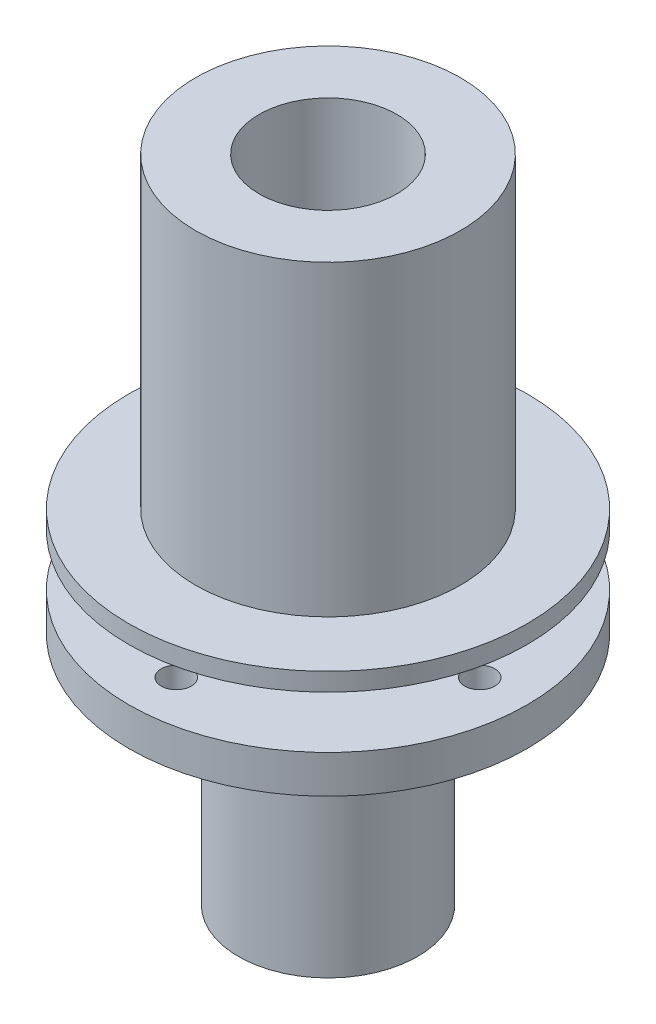
ISO-10303-21;
HEADER;
FILE_DESCRIPTION(('STEP AP214'),'2;1');
FILE_NAME('part.step','',(''),(''),'','','');
FILE_SCHEMA(('AUTOMOTIVE_DESIGN { 1 0 10303 214 1 1 1 1 }'));
ENDSEC;
DATA;
#1=APPLICATION_CONTEXT('core data for automotive mechanical design processes');
#2=APPLICATION_PROTOCOL_DEFINITION('international standard','automotive_design',2000,#1);
#3=PRODUCT_CONTEXT('',#1,'mechanical');
#4=PRODUCT('Part','Part','',(#3));
#5=PRODUCT_RELATED_PRODUCT_CATEGORY('part','',(#4));
#6=PRODUCT_DEFINITION_FORMATION('','',#4);
#7=PRODUCT_DEFINITION_CONTEXT('part definition',#1,'design');
#8=PRODUCT_DEFINITION('design','',#6,#7);
#9=PRODUCT_DEFINITION_SHAPE('','',#8);
#10=(LENGTH_UNIT() NAMED_UNIT(*) SI_UNIT(.MILLI.,.METRE.));
#11=(NAMED_UNIT(*) PLANE_ANGLE_UNIT() SI_UNIT($,.RADIAN.));
#12=(NAMED_UNIT(*) SI_UNIT($,.STERADIAN.) SOLID_ANGLE_UNIT());
#13=UNCERTAINTY_MEASURE_WITH_UNIT(LENGTH_MEASURE(1.E-05),#10,'distance_accuracy_value','');
#14=(GEOMETRIC_REPRESENTATION_CONTEXT(3) GLOBAL_UNCERTAINTY_ASSIGNED_CONTEXT((#13)) GLOBAL_UNIT_ASSIGNED_CONTEXT((#10,
#11,#12)) REPRESENTATION_CONTEXT('',''));
#15=CARTESIAN_POINT('',(0.,0.,0.));
#16=DIRECTION('',(0.,0.,1.));
#17=DIRECTION('',(1.,0.,0.));
#18=AXIS2_PLACEMENT_3D('',#15,#16,#17);
#19=CARTESIAN_POINT('',(0.,109.47402,0.));
#20=DIRECTION('',(0.,1.,0.));
#21=DIRECTION('',(0.,0.,1.));
#22=AXIS2_PLACEMENT_3D('',#19,#20,#21);
#23=PLANE('',#22);
#24=CARTESIAN_POINT('',(0.,109.47402,0.));
#25=DIRECTION('',(0.,1.,0.));
#26=DIRECTION('',(0.,0.,1.));
#27=AXIS2_PLACEMENT_3D('',#24,#25,#26);
#28=CIRCLE('',#27,34.925);
#29=CARTESIAN_POINT('',(0.,109.47402,34.925));
#30=VERTEX_POINT('',#29);
#31=EDGE_CURVE('E11',#30,#30,#28,.T.);
#32=ORIENTED_EDGE('',*,*,#31,.T.);
#33=EDGE_LOOP('',(#32));
#34=FACE_BOUND('',#33,.T.);
#35=CARTESIAN_POINT('',(0.,109.47402,0.));
#36=DIRECTION('',(0.,1.,0.));
#37=DIRECTION('',(0.,0.,1.));
#38=AXIS2_PLACEMENT_3D('',#35,#36,#37);
#39=CIRCLE('',#38,18.161);
#40=CARTESIAN_POINT('',(0.,109.47402,18.161));
#41=VERTEX_POINT('',#40);
#42=EDGE_CURVE('E61',#41,#41,#39,.T.);
#43=ORIENTED_EDGE('',*,*,#42,.F.);
#44=EDGE_LOOP('',(#43));
#45=FACE_BOUND('',#44,.T.);
#46=ADVANCED_FACE('F50',(#34,#45),#23,.T.);
#47=CARTESIAN_POINT('',(0.,28.51152,0.));
#48=DIRECTION('',(0.,1.,0.));
#49=DIRECTION('',(0.,0.,1.));
#50=AXIS2_PLACEMENT_3D('',#47,#48,#49);
#51=PLANE('',#50);
#52=CARTESIAN_POINT('',(0.,28.51152,0.));
#53=DIRECTION('',(0.,1.,0.));
#54=DIRECTION('',(0.,0.,1.));
#55=AXIS2_PLACEMENT_3D('',#52,#53,#54);
#56=CIRCLE('',#55,34.925);
#57=CARTESIAN_POINT('',(0.,28.51152,34.925));
#58=VERTEX_POINT('',#57);
#59=EDGE_CURVE('E54',#58,#58,#56,.T.);
#60=ORIENTED_EDGE('',*,*,#59,.F.);
#61=EDGE_LOOP('',(#60));
#62=FACE_BOUND('',#61,.T.);
#63=CARTESIAN_POINT('',(0.,28.51152,0.));
#64=DIRECTION('',(0.,1.,0.));
#65=DIRECTION('',(0.,0.,1.));
#66=AXIS2_PLACEMENT_3D('',#63,#64,#65);
#67=CIRCLE('',#66,18.161);
#68=CARTESIAN_POINT('',(0.,28.51152,18.161));
#69=VERTEX_POINT('',#68);
#70=EDGE_CURVE('E63',#69,#69,#67,.T.);
#71=ORIENTED_EDGE('',*,*,#70,.T.);
#72=EDGE_LOOP('',(#71));
#73=FACE_BOUND('',#72,.T.);
#74=ADVANCED_FACE('F73',(#62,#73),#51,.F.);
#75=CARTESIAN_POINT('',(0.,109.47402,0.));
#76=DIRECTION('',(0.,-1.,0.));
#77=DIRECTION('',(0.,0.,-1.));
#78=AXIS2_PLACEMENT_3D('',#75,#76,#77);
#79=CYLINDRICAL_SURFACE('',#78,34.925);
#80=ORIENTED_EDGE('',*,*,#31,.F.);
#81=EDGE_LOOP('',(#80));
#82=FACE_BOUND('',#81,.T.);
#83=ORIENTED_EDGE('',*,*,#59,.T.);
#84=EDGE_LOOP('',(#83));
#85=FACE_BOUND('',#84,.T.);
#86=ADVANCED_FACE('F52',(#82,#85),#79,.T.);
#87=CARTESIAN_POINT('',(0.,109.47402,0.));
#88=DIRECTION('',(0.,-1.,0.));
#89=DIRECTION('',(0.,0.,-1.));
#90=AXIS2_PLACEMENT_3D('',#87,#88,#89);
#91=CYLINDRICAL_SURFACE('',#90,18.161);
#92=ORIENTED_EDGE('',*,*,#42,.T.);
#93=EDGE_LOOP('',(#92));
#94=FACE_BOUND('',#93,.T.);
#95=ORIENTED_EDGE('',*,*,#70,.F.);
#96=EDGE_LOOP('',(#95));
#97=FACE_BOUND('',#96,.T.);
#98=ADVANCED_FACE('F69',(#94,#97),#91,.F.);
#99=CLOSED_SHELL('',(#46,#74,#86,#98));
#100=MANIFOLD_SOLID_BREP('B2',#99);
#101=CARTESIAN_POINT('',(0.,28.51152,0.));
#102=DIRECTION('',(0.,-1.,0.));
#103=DIRECTION('',(0.,0.,-1.));
#104=AXIS2_PLACEMENT_3D('',#101,#102,#103);
#105=CYLINDRICAL_SURFACE('',#104,25.4);
#106=CARTESIAN_POINT('',(0.,28.51152,0.));
#107=DIRECTION('',(0.,1.,0.));
#108=DIRECTION('',(0.,0.,1.));
#109=AXIS2_PLACEMENT_3D('',#106,#107,#108);
#110=CIRCLE('',#109,25.4);
#111=CARTESIAN_POINT('',(0.,28.51152,-25.4));
#112=VERTEX_POINT('',#111);
#113=EDGE_CURVE('E126',#112,#112,#110,.T.);
#114=CARTESIAN_POINT('',(0.,23.74902,0.));
#115=DIRECTION('',(0.,1.,0.));
#116=DIRECTION('',(0.,0.,1.));
#117=AXIS2_PLACEMENT_3D('',#114,#115,#116);
#118=CIRCLE('',#117,25.4);
#119=CARTESIAN_POINT('',(0.,23.74902,-25.4));
#120=VERTEX_POINT('',#119);
#121=EDGE_CURVE('E132',#120,#120,#118,.T.);
#122=CARTESIAN_POINT('',(0.,28.51152,-25.4));
#123=CARTESIAN_POINT('',(0.,28.461910625,-25.4));
#124=CARTESIAN_POINT('',(0.,28.41230125,-25.4));
#125=CARTESIAN_POINT('',(0.,28.3130825,-25.4));
#126=CARTESIAN_POINT('',(0.,28.263473125,-25.4));
#127=CARTESIAN_POINT('',(0.,28.164254375,-25.4));
#128=CARTESIAN_POINT('',(0.,28.114645,-25.4));
#129=CARTESIAN_POINT('',(0.,28.01542625,-25.4));
#130=CARTESIAN_POINT('',(0.,27.965816875,-25.4));
#131=CARTESIAN_POINT('',(0.,27.866598125,-25.4));
#132=CARTESIAN_POINT('',(0.,27.81698875,-25.4));
#133=CARTESIAN_POINT('',(0.,27.71777,-25.4));
#134=CARTESIAN_POINT('',(0.,27.668160625,-25.4));
#135=CARTESIAN_POINT('',(0.,27.568941875,-25.4));
#136=CARTESIAN_POINT('',(0.,27.5193325,-25.4));
#137=CARTESIAN_POINT('',(0.,27.42011375,-25.4));
#138=CARTESIAN_POINT('',(0.,27.370504375,-25.4));
#139=CARTESIAN_POINT('',(0.,27.271285625,-25.4));
#140=CARTESIAN_POINT('',(0.,27.22167625,-25.4));
#141=CARTESIAN_POINT('',(0.,27.1224575,-25.4));
#142=CARTESIAN_POINT('',(0.,27.072848125,-25.4));
#143=CARTESIAN_POINT('',(0.,26.973629375,-25.4));
#144=CARTESIAN_POINT('',(0.,26.92402,-25.4));
#145=CARTESIAN_POINT('',(0.,26.82480125,-25.4));
#146=CARTESIAN_POINT('',(0.,26.775191875,-25.4));
#147=CARTESIAN_POINT('',(0.,26.675973125,-25.4));
#148=CARTESIAN_POINT('',(0.,26.62636375,-25.4));
#149=CARTESIAN_POINT('',(0.,26.527145,-25.4));
#150=CARTESIAN_POINT('',(0.,26.477535625,-25.4));
#151=CARTESIAN_POINT('',(0.,26.378316875,-25.4));
#152=CARTESIAN_POINT('',(0.,26.3287075,-25.4));
#153=CARTESIAN_POINT('',(0.,26.22948875,-25.4));
#154=CARTESIAN_POINT('',(0.,26.179879375,-25.4));
#155=CARTESIAN_POINT('',(0.,26.080660625,-25.4));
#156=CARTESIAN_POINT('',(0.,26.03105125,-25.4));
#157=CARTESIAN_POINT('',(0.,25.9318325,-25.4));
#158=CARTESIAN_POINT('',(0.,25.882223125,-25.4));
#159=CARTESIAN_POINT('',(0.,25.783004375,-25.4));
#160=CARTESIAN_POINT('',(0.,25.733395,-25.4));
#161=CARTESIAN_POINT('',(0.,25.63417625,-25.4));
#162=CARTESIAN_POINT('',(0.,25.584566875,-25.4));
#163=CARTESIAN_POINT('',(0.,25.485348125,-25.4));
#164=CARTESIAN_POINT('',(0.,25.43573875,-25.4));
#165=CARTESIAN_POINT('',(0.,25.33652,-25.4));
#166=CARTESIAN_POINT('',(0.,25.286910625,-25.4));
#167=CARTESIAN_POINT('',(0.,25.187691875,-25.4));
#168=CARTESIAN_POINT('',(0.,25.1380825,-25.4));
#169=CARTESIAN_POINT('',(0.,25.03886375,-25.4));
#170=CARTESIAN_POINT('',(0.,24.989254375,-25.4));
#171=CARTESIAN_POINT('',(0.,24.890035625,-25.4));
#172=CARTESIAN_POINT('',(0.,24.84042625,-25.4));
#173=CARTESIAN_POINT('',(0.,24.7412075,-25.4));
#174=CARTESIAN_POINT('',(0.,24.691598125,-25.4));
#175=CARTESIAN_POINT('',(0.,24.592379375,-25.4));
#176=CARTESIAN_POINT('',(0.,24.54277,-25.4));
#177=CARTESIAN_POINT('',(0.,24.44355125,-25.4));
#178=CARTESIAN_POINT('',(0.,24.393941875,-25.4));
#179=CARTESIAN_POINT('',(0.,24.294723125,-25.4));
#180=CARTESIAN_POINT('',(0.,24.24511375,-25.4));
#181=CARTESIAN_POINT('',(0.,24.145895,-25.4));
#182=CARTESIAN_POINT('',(0.,24.096285625,-25.4));
#183=CARTESIAN_POINT('',(0.,23.997066875,-25.4));
#184=CARTESIAN_POINT('',(0.,23.9474575,-25.4));
#185=CARTESIAN_POINT('',(0.,23.84823875,-25.4));
#186=CARTESIAN_POINT('',(0.,23.798629375,-25.4));
#187=CARTESIAN_POINT('',(0.,23.74902,-25.4));
#188=B_SPLINE_CURVE_WITH_KNOTS('',3,(#122,#123,#124,#125,#126,#127,#128,#129,#130,#131,#132,
#133,#134,#135,#136,#137,#138,#139,#140,#141,#142,#143,#144,#145,#146,#147,#148,#149,#150,#151,
#152,#153,#154,#155,#156,#157,#158,#159,#160,#161,#162,#163,#164,#165,#166,#167,#168,#169,#170,
#171,#172,#173,#174,#175,#176,#177,#178,#179,#180,#181,#182,#183,#184,#185,#186,#187),
.UNSPECIFIED.,.F.,.F.,(4,2,2,2,2,2,2,2,2,2,2,2,2,2,2,2,2,2,2,2,2,2,2,2,2,2,2,2,2,2,2,2,4),(0.,
0.148828124999997,0.297656249999997,0.446484374999997,0.595312499999997,0.744140624999997,
0.892968749999997,1.041796875,1.190625,1.339453125,1.48828125,1.637109375,1.7859375,1.934765625,
2.08359375,2.232421875,2.38125,2.530078125,2.67890625,2.827734375,2.9765625,3.125390625,
3.27421875,3.423046875,3.571875,3.720703125,3.86953125,4.018359375,4.1671875,4.316015625,
4.46484375,4.613671875,4.7625),.UNSPECIFIED.);
#189=EDGE_CURVE('BSEAM119',#112,#120,#188,.T.);
#190=ORIENTED_EDGE('',*,*,#113,.T.);
#191=ORIENTED_EDGE('',*,*,#121,.F.);
#192=ORIENTED_EDGE('',*,*,#189,.T.);
#193=ORIENTED_EDGE('',*,*,#189,.F.);
#194=EDGE_LOOP('',(#190,#192,#191,#193));
#195=FACE_BOUND('',#194,.T.);
#196=ADVANCED_FACE('F119',(#195),#105,.F.);
#197=CARTESIAN_POINT('',(0.,28.51152,0.));
#198=DIRECTION('',(0.,-1.,0.));
#199=DIRECTION('',(0.,0.,-1.));
#200=AXIS2_PLACEMENT_3D('',#197,#198,#199);
#201=CYLINDRICAL_SURFACE('',#200,52.500000029);
#202=CARTESIAN_POINT('',(0.,28.51152,0.));
#203=DIRECTION('',(0.,1.,0.));
#204=DIRECTION('',(0.,0.,1.));
#205=AXIS2_PLACEMENT_3D('',#202,#203,#204);
#206=CIRCLE('',#205,52.500000029);
#207=CARTESIAN_POINT('',(0.,28.51152,-52.500000029));
#208=VERTEX_POINT('',#207);
#209=EDGE_CURVE('E49',#208,#208,#206,.T.);
#210=CARTESIAN_POINT('',(0.,23.74902,0.));
#211=DIRECTION('',(0.,1.,0.));
#212=DIRECTION('',(0.,0.,1.));
#213=AXIS2_PLACEMENT_3D('',#210,#211,#212);
#214=CIRCLE('',#213,52.500000029);
#215=CARTESIAN_POINT('',(0.,23.74902,-52.500000029));
#216=VERTEX_POINT('',#215);
#217=EDGE_CURVE('E122',#216,#216,#214,.T.);
#218=CARTESIAN_POINT('',(0.,28.51152,-52.500000029));
#219=CARTESIAN_POINT('',(0.,28.461910625,-52.500000029));
#220=CARTESIAN_POINT('',(0.,28.41230125,-52.500000029));
#221=CARTESIAN_POINT('',(0.,28.3130825,-52.500000029));
#222=CARTESIAN_POINT('',(0.,28.263473125,-52.500000029));
#223=CARTESIAN_POINT('',(0.,28.164254375,-52.500000029));
#224=CARTESIAN_POINT('',(0.,28.114645,-52.500000029));
#225=CARTESIAN_POINT('',(0.,28.01542625,-52.500000029));
#226=CARTESIAN_POINT('',(0.,27.965816875,-52.500000029));
#227=CARTESIAN_POINT('',(0.,27.866598125,-52.500000029));
#228=CARTESIAN_POINT('',(0.,27.81698875,-52.500000029));
#229=CARTESIAN_POINT('',(0.,27.71777,-52.500000029));
#230=CARTESIAN_POINT('',(0.,27.668160625,-52.500000029));
#231=CARTESIAN_POINT('',(0.,27.568941875,-52.500000029));
#232=CARTESIAN_POINT('',(0.,27.5193325,-52.500000029));
#233=CARTESIAN_POINT('',(0.,27.42011375,-52.500000029));
#234=CARTESIAN_POINT('',(0.,27.370504375,-52.500000029));
#235=CARTESIAN_POINT('',(0.,27.271285625,-52.500000029));
#236=CARTESIAN_POINT('',(0.,27.22167625,-52.500000029));
#237=CARTESIAN_POINT('',(0.,27.1224575,-52.500000029));
#238=CARTESIAN_POINT('',(0.,27.072848125,-52.500000029));
#239=CARTESIAN_POINT('',(0.,26.973629375,-52.500000029));
#240=CARTESIAN_POINT('',(0.,26.92402,-52.500000029));
#241=CARTESIAN_POINT('',(0.,26.82480125,-52.500000029));
#242=CARTESIAN_POINT('',(0.,26.775191875,-52.500000029));
#243=CARTESIAN_POINT('',(0.,26.675973125,-52.500000029));
#244=CARTESIAN_POINT('',(0.,26.62636375,-52.500000029));
#245=CARTESIAN_POINT('',(0.,26.527145,-52.500000029));
#246=CARTESIAN_POINT('',(0.,26.477535625,-52.500000029));
#247=CARTESIAN_POINT('',(0.,26.378316875,-52.500000029));
#248=CARTESIAN_POINT('',(0.,26.3287075,-52.500000029));
#249=CARTESIAN_POINT('',(0.,26.22948875,-52.500000029));
#250=CARTESIAN_POINT('',(0.,26.179879375,-52.500000029));
#251=CARTESIAN_POINT('',(0.,26.080660625,-52.500000029));
#252=CARTESIAN_POINT('',(0.,26.03105125,-52.500000029));
#253=CARTESIAN_POINT('',(0.,25.9318325,-52.500000029));
#254=CARTESIAN_POINT('',(0.,25.882223125,-52.500000029));
#255=CARTESIAN_POINT('',(0.,25.783004375,-52.500000029));
#256=CARTESIAN_POINT('',(0.,25.733395,-52.500000029));
#257=CARTESIAN_POINT('',(0.,25.63417625,-52.500000029));
#258=CARTESIAN_POINT('',(0.,25.584566875,-52.500000029));
#259=CARTESIAN_POINT('',(0.,25.485348125,-52.500000029));
#260=CARTESIAN_POINT('',(0.,25.43573875,-52.500000029));
#261=CARTESIAN_POINT('',(0.,25.33652,-52.500000029));
#262=CARTESIAN_POINT('',(0.,25.286910625,-52.500000029));
#263=CARTESIAN_POINT('',(0.,25.187691875,-52.500000029));
#264=CARTESIAN_POINT('',(0.,25.1380825,-52.500000029));
#265=CARTESIAN_POINT('',(0.,25.03886375,-52.500000029));
#266=CARTESIAN_POINT('',(0.,24.989254375,-52.500000029));
#267=CARTESIAN_POINT('',(0.,24.890035625,-52.500000029));
#268=CARTESIAN_POINT('',(0.,24.84042625,-52.500000029));
#269=CARTESIAN_POINT('',(0.,24.7412075,-52.500000029));
#270=CARTESIAN_POINT('',(0.,24.691598125,-52.500000029));
#271=CARTESIAN_POINT('',(0.,24.592379375,-52.500000029));
#272=CARTESIAN_POINT('',(0.,24.54277,-52.500000029));
#273=CARTESIAN_POINT('',(0.,24.44355125,-52.500000029));
#274=CARTESIAN_POINT('',(0.,24.393941875,-52.500000029));
#275=CARTESIAN_POINT('',(0.,24.294723125,-52.500000029));
#276=CARTESIAN_POINT('',(0.,24.24511375,-52.500000029));
#277=CARTESIAN_POINT('',(0.,24.145895,-52.500000029));
#278=CARTESIAN_POINT('',(0.,24.096285625,-52.500000029));
#279=CARTESIAN_POINT('',(0.,23.997066875,-52.500000029));
#280=CARTESIAN_POINT('',(0.,23.9474575,-52.500000029));
#281=CARTESIAN_POINT('',(0.,23.84823875,-52.500000029));
#282=CARTESIAN_POINT('',(0.,23.798629375,-52.500000029));
#283=CARTESIAN_POINT('',(0.,23.74902,-52.500000029));
#284=B_SPLINE_CURVE_WITH_KNOTS('',3,(#218,#219,#220,#221,#222,#223,#224,#225,#226,#227,#228,
#229,#230,#231,#232,#233,#234,#235,#236,#237,#238,#239,#240,#241,#242,#243,#244,#245,#246,#247,
#248,#249,#250,#251,#252,#253,#254,#255,#256,#257,#258,#259,#260,#261,#262,#263,#264,#265,#266,
#267,#268,#269,#270,#271,#272,#273,#274,#275,#276,#277,#278,#279,#280,#281,#282,#283),
.UNSPECIFIED.,.F.,.F.,(4,2,2,2,2,2,2,2,2,2,2,2,2,2,2,2,2,2,2,2,2,2,2,2,2,2,2,2,2,2,2,2,4),(0.,
0.148828124999997,0.297656249999997,0.446484374999997,0.595312499999997,0.744140624999997,
0.892968749999997,1.041796875,1.190625,1.339453125,1.48828125,1.637109375,1.7859375,1.934765625,
2.08359375,2.232421875,2.38125,2.530078125,2.67890625,2.827734375,2.9765625,3.125390625,
3.27421875,3.423046875,3.571875,3.720703125,3.86953125,4.018359375,4.1671875,4.316015625,
4.46484375,4.613671875,4.7625),.UNSPECIFIED.);
#285=EDGE_CURVE('BSEAM139',#208,#216,#284,.T.);
#286=ORIENTED_EDGE('',*,*,#209,.F.);
#287=ORIENTED_EDGE('',*,*,#217,.T.);
#288=ORIENTED_EDGE('',*,*,#285,.T.);
#289=ORIENTED_EDGE('',*,*,#285,.F.);
#290=EDGE_LOOP('',(#286,#288,#287,#289));
#291=FACE_BOUND('',#290,.T.);
#292=ADVANCED_FACE('F139',(#291),#201,.T.);
#293=CARTESIAN_POINT('',(0.,28.51152,0.));
#294=DIRECTION('',(0.,1.,0.));
#295=DIRECTION('',(0.,0.,1.));
#296=AXIS2_PLACEMENT_3D('',#293,#294,#295);
#297=PLANE('',#296);
#298=ORIENTED_EDGE('',*,*,#113,.F.);
#299=EDGE_LOOP('',(#298));
#300=FACE_BOUND('',#299,.T.);
#301=ORIENTED_EDGE('',*,*,#209,.T.);
#302=EDGE_LOOP('',(#301));
#303=FACE_BOUND('',#302,.T.);
#304=ADVANCED_FACE('F143',(#300,#303),#297,.T.);
#305=CARTESIAN_POINT('',(0.,23.74902,0.));
#306=DIRECTION('',(0.,1.,0.));
#307=DIRECTION('',(0.,0.,1.));
#308=AXIS2_PLACEMENT_3D('',#305,#306,#307);
#309=PLANE('',#308);
#310=ORIENTED_EDGE('',*,*,#121,.T.);
#311=EDGE_LOOP('',(#310));
#312=FACE_BOUND('',#311,.T.);
#313=ORIENTED_EDGE('',*,*,#217,.F.);
#314=EDGE_LOOP('',(#313));
#315=FACE_BOUND('',#314,.T.);
#316=ADVANCED_FACE('F141',(#312,#315),#309,.F.);
#317=CLOSED_SHELL('',(#196,#292,#304,#316));
#318=MANIFOLD_SOLID_BREP('B6',#317);
#319=CARTESIAN_POINT('',(0.,10.,0.));
#320=DIRECTION('',(0.,-1.,0.));
#321=DIRECTION('',(0.,0.,-1.));
#322=AXIS2_PLACEMENT_3D('',#319,#320,#321);
#323=CYLINDRICAL_SURFACE('',#322,52.500000029);
#324=CARTESIAN_POINT('',(0.,10.,0.));
#325=DIRECTION('',(0.,1.,0.));
#326=DIRECTION('',(0.,0.,1.));
#327=AXIS2_PLACEMENT_3D('',#324,#325,#326);
#328=CIRCLE('',#327,52.500000029);
#329=CARTESIAN_POINT('',(0.,10.,52.500000029));
#330=VERTEX_POINT('',#329);
#331=EDGE_CURVE('E206',#330,#330,#328,.T.);
#332=ORIENTED_EDGE('',*,*,#331,.F.);
#333=EDGE_LOOP('',(#332));
#334=FACE_BOUND('',#333,.T.);
#335=CARTESIAN_POINT('',(0.,0.,0.));
#336=DIRECTION('',(0.,1.,0.));
#337=DIRECTION('',(0.,0.,1.));
#338=AXIS2_PLACEMENT_3D('',#335,#336,#337);
#339=CIRCLE('',#338,52.500000029);
#340=CARTESIAN_POINT('',(0.,0.,52.500000029));
#341=VERTEX_POINT('',#340);
#342=EDGE_CURVE('E184',#341,#341,#339,.T.);
#343=ORIENTED_EDGE('',*,*,#342,.T.);
#344=EDGE_LOOP('',(#343));
#345=FACE_BOUND('',#344,.T.);
#346=ADVANCED_FACE('F181',(#334,#345),#323,.T.);
#347=CARTESIAN_POINT('',(0.,10.,0.));
#348=DIRECTION('',(0.,1.,0.));
#349=DIRECTION('',(0.,0.,1.));
#350=AXIS2_PLACEMENT_3D('',#347,#348,#349);
#351=PLANE('',#350);
#352=CARTESIAN_POINT('',(0.,10.,40.));
#353=DIRECTION('',(0.,1.,0.));
#354=DIRECTION('',(0.,0.,1.));
#355=AXIS2_PLACEMENT_3D('',#352,#353,#354);
#356=CIRCLE('',#355,3.96874999999999);
#357=CARTESIAN_POINT('',(0.,10.,43.96875));
#358=VERTEX_POINT('',#357);
#359=EDGE_CURVE('E425',#358,#358,#356,.T.);
#360=ORIENTED_EDGE('',*,*,#359,.F.);
#361=EDGE_LOOP('',(#360));
#362=FACE_BOUND('',#361,.T.);
#363=CARTESIAN_POINT('',(-40.,10.,0.));
#364=DIRECTION('',(0.,1.,0.));
#365=DIRECTION('',(0.,0.,1.));
#366=AXIS2_PLACEMENT_3D('',#363,#364,#365);
#367=CIRCLE('',#366,3.96874999999999);
#368=CARTESIAN_POINT('',(-40.,10.,3.96874999999998));
#369=VERTEX_POINT('',#368);
#370=EDGE_CURVE('E419',#369,#369,#367,.T.);
#371=ORIENTED_EDGE('',*,*,#370,.F.);
#372=EDGE_LOOP('',(#371));
#373=FACE_BOUND('',#372,.T.);
#374=CARTESIAN_POINT('',(2.79318507107451E-13,10.,-40.));
#375=DIRECTION('',(0.,1.,0.));
#376=DIRECTION('',(0.,0.,1.));
#377=AXIS2_PLACEMENT_3D('',#374,#375,#376);
#378=CIRCLE('',#377,3.96874999999999);
#379=CARTESIAN_POINT('',(2.79318507107451E-13,10.,-36.03125));
#380=VERTEX_POINT('',#379);
#381=EDGE_CURVE('E411',#380,#380,#378,.T.);
#382=ORIENTED_EDGE('',*,*,#381,.F.);
#383=EDGE_LOOP('',(#382));
#384=FACE_BOUND('',#383,.T.);
#385=CARTESIAN_POINT('',(40.,10.,0.));
#386=DIRECTION('',(0.,1.,0.));
#387=DIRECTION('',(0.,0.,1.));
#388=AXIS2_PLACEMENT_3D('',#385,#386,#387);
#389=CIRCLE('',#388,3.96874999999999);
#390=CARTESIAN_POINT('',(40.,10.,3.96875));
#391=VERTEX_POINT('',#390);
#392=EDGE_CURVE('E405',#391,#391,#389,.T.);
#393=ORIENTED_EDGE('',*,*,#392,.F.);
#394=EDGE_LOOP('',(#393));
#395=FACE_BOUND('',#394,.T.);
#396=CARTESIAN_POINT('',(0.,10.,0.));
#397=DIRECTION('',(0.,1.,0.));
#398=DIRECTION('',(0.,0.,1.));
#399=AXIS2_PLACEMENT_3D('',#396,#397,#398);
#400=CIRCLE('',#399,25.4);
#401=CARTESIAN_POINT('',(0.,10.,25.4));
#402=VERTEX_POINT('',#401);
#403=EDGE_CURVE('E118',#402,#402,#400,.T.);
#404=ORIENTED_EDGE('',*,*,#403,.F.);
#405=EDGE_LOOP('',(#404));
#406=FACE_BOUND('',#405,.T.);
#407=ORIENTED_EDGE('',*,*,#331,.T.);
#408=EDGE_LOOP('',(#407));
#409=FACE_BOUND('',#408,.T.);
#410=ADVANCED_FACE('F217',(#362,#373,#384,#395,#406,#409),#351,.T.);
#411=CARTESIAN_POINT('',(0.,0.,0.));
#412=DIRECTION('',(0.,1.,0.));
#413=DIRECTION('',(0.,0.,1.));
#414=AXIS2_PLACEMENT_3D('',#411,#412,#413);
#415=PLANE('',#414);
#416=CARTESIAN_POINT('',(0.,0.,40.));
#417=DIRECTION('',(0.,-1.,0.));
#418=DIRECTION('',(0.,0.,-1.));
#419=AXIS2_PLACEMENT_3D('',#416,#417,#418);
#420=CIRCLE('',#419,3.96874999999999);
#421=CARTESIAN_POINT('',(0.,0.,36.03125));
#422=VERTEX_POINT('',#421);
#423=EDGE_CURVE('E428',#422,#422,#420,.T.);
#424=ORIENTED_EDGE('',*,*,#423,.F.);
#425=EDGE_LOOP('',(#424));
#426=FACE_BOUND('',#425,.T.);
#427=CARTESIAN_POINT('',(-40.,0.,0.));
#428=DIRECTION('',(0.,-1.,0.));
#429=DIRECTION('',(0.,0.,-1.));
#430=AXIS2_PLACEMENT_3D('',#427,#428,#429);
#431=CIRCLE('',#430,3.96874999999999);
#432=CARTESIAN_POINT('',(-40.,0.,-3.96875));
#433=VERTEX_POINT('',#432);
#434=EDGE_CURVE('E422',#433,#433,#431,.T.);
#435=ORIENTED_EDGE('',*,*,#434,.F.);
#436=EDGE_LOOP('',(#435));
#437=FACE_BOUND('',#436,.T.);
#438=CARTESIAN_POINT('',(2.79318507107451E-13,0.,-40.));
#439=DIRECTION('',(0.,-1.,0.));
#440=DIRECTION('',(0.,0.,-1.));
#441=AXIS2_PLACEMENT_3D('',#438,#439,#440);
#442=CIRCLE('',#441,3.96874999999999);
#443=CARTESIAN_POINT('',(2.79318507107451E-13,0.,-43.96875));
#444=VERTEX_POINT('',#443);
#445=EDGE_CURVE('E416',#444,#444,#442,.T.);
#446=ORIENTED_EDGE('',*,*,#445,.F.);
#447=EDGE_LOOP('',(#446));
#448=FACE_BOUND('',#447,.T.);
#449=CARTESIAN_POINT('',(40.,0.,0.));
#450=DIRECTION('',(0.,-1.,0.));
#451=DIRECTION('',(0.,0.,-1.));
#452=AXIS2_PLACEMENT_3D('',#449,#450,#451);
#453=CIRCLE('',#452,3.96874999999999);
#454=CARTESIAN_POINT('',(40.,0.,-3.96874999999998));
#455=VERTEX_POINT('',#454);
#456=EDGE_CURVE('E407',#455,#455,#453,.T.);
#457=ORIENTED_EDGE('',*,*,#456,.F.);
#458=EDGE_LOOP('',(#457));
#459=FACE_BOUND('',#458,.T.);
#460=CARTESIAN_POINT('',(0.,0.,0.));
#461=DIRECTION('',(0.,-1.,0.));
#462=DIRECTION('',(0.,0.,-1.));
#463=AXIS2_PLACEMENT_3D('',#460,#461,#462);
#464=CIRCLE('',#463,27.435);
#465=CARTESIAN_POINT('',(0.,0.,-27.435));
#466=VERTEX_POINT('',#465);
#467=EDGE_CURVE('E193',#466,#466,#464,.T.);
#468=ORIENTED_EDGE('',*,*,#467,.F.);
#469=EDGE_LOOP('',(#468));
#470=FACE_BOUND('',#469,.T.);
#471=ORIENTED_EDGE('',*,*,#342,.F.);
#472=EDGE_LOOP('',(#471));
#473=FACE_BOUND('',#472,.T.);
#474=ADVANCED_FACE('F214',(#426,#437,#448,#459,#470,#473),#415,.F.);
#475=CARTESIAN_POINT('',(0.,-7.,0.));
#476=DIRECTION('',(0.,1.,0.));
#477=DIRECTION('',(0.,0.,1.));
#478=AXIS2_PLACEMENT_3D('',#475,#476,#477);
#479=CYLINDRICAL_SURFACE('',#478,27.435);
#480=CARTESIAN_POINT('',(0.,-7.,0.));
#481=DIRECTION('',(0.,-1.,0.));
#482=DIRECTION('',(0.,0.,-1.));
#483=AXIS2_PLACEMENT_3D('',#480,#481,#482);
#484=CIRCLE('',#483,27.435);
#485=CARTESIAN_POINT('',(0.,-7.,-27.435));
#486=VERTEX_POINT('',#485);
#487=EDGE_CURVE('E201',#486,#486,#484,.T.);
#488=ORIENTED_EDGE('',*,*,#487,.F.);
#489=EDGE_LOOP('',(#488));
#490=FACE_BOUND('',#489,.T.);
#491=ORIENTED_EDGE('',*,*,#467,.T.);
#492=EDGE_LOOP('',(#491));
#493=FACE_BOUND('',#492,.T.);
#494=ADVANCED_FACE('F216',(#490,#493),#479,.T.);
#495=CARTESIAN_POINT('',(0.,-7.,0.));
#496=DIRECTION('',(0.,-1.,0.));
#497=DIRECTION('',(0.,0.,-1.));
#498=AXIS2_PLACEMENT_3D('',#495,#496,#497);
#499=PLANE('',#498);
#500=CARTESIAN_POINT('',(0.,-7.,0.));
#501=DIRECTION('',(0.,-1.,0.));
#502=DIRECTION('',(0.,0.,-1.));
#503=AXIS2_PLACEMENT_3D('',#500,#501,#502);
#504=CIRCLE('',#503,22.225);
#505=CARTESIAN_POINT('',(0.,-7.,-22.225));
#506=VERTEX_POINT('',#505);
#507=EDGE_CURVE('E188',#506,#506,#504,.T.);
#508=ORIENTED_EDGE('',*,*,#507,.F.);
#509=EDGE_LOOP('',(#508));
#510=FACE_BOUND('',#509,.T.);
#511=ORIENTED_EDGE('',*,*,#487,.T.);
#512=EDGE_LOOP('',(#511));
#513=FACE_BOUND('',#512,.T.);
#514=ADVANCED_FACE('F223',(#510,#513),#499,.T.);
#515=CARTESIAN_POINT('',(0.,-14.287514,0.));
#516=DIRECTION('',(0.,1.,0.));
#517=DIRECTION('',(0.,0.,1.));
#518=AXIS2_PLACEMENT_3D('',#515,#516,#517);
#519=CYLINDRICAL_SURFACE('',#518,22.225);
#520=CARTESIAN_POINT('',(0.,-14.287514,0.));
#521=DIRECTION('',(0.,-1.,0.));
#522=DIRECTION('',(0.,0.,-1.));
#523=AXIS2_PLACEMENT_3D('',#520,#521,#522);
#524=CIRCLE('',#523,22.225);
#525=CARTESIAN_POINT('',(0.,-14.287514,-22.225));
#526=VERTEX_POINT('',#525);
#527=EDGE_CURVE('E199',#526,#526,#524,.T.);
#528=ORIENTED_EDGE('',*,*,#527,.F.);
#529=EDGE_LOOP('',(#528));
#530=FACE_BOUND('',#529,.T.);
#531=ORIENTED_EDGE('',*,*,#507,.T.);
#532=EDGE_LOOP('',(#531));
#533=FACE_BOUND('',#532,.T.);
#534=ADVANCED_FACE('F344',(#530,#533),#519,.T.);
#535=CARTESIAN_POINT('',(0.,23.74902,0.));
#536=DIRECTION('',(0.,-1.,0.));
#537=DIRECTION('',(0.,0.,-1.));
#538=AXIS2_PLACEMENT_3D('',#535,#536,#537);
#539=CYLINDRICAL_SURFACE('',#538,25.4);
#540=CARTESIAN_POINT('',(0.,23.74902,0.));
#541=DIRECTION('',(0.,1.,0.));
#542=DIRECTION('',(0.,0.,1.));
#543=AXIS2_PLACEMENT_3D('',#540,#541,#542);
#544=CIRCLE('',#543,25.4);
#545=CARTESIAN_POINT('',(0.,23.74902,25.4));
#546=VERTEX_POINT('',#545);
#547=EDGE_CURVE('E197',#546,#546,#544,.T.);
#548=ORIENTED_EDGE('',*,*,#547,.F.);
#549=EDGE_LOOP('',(#548));
#550=FACE_BOUND('',#549,.T.);
#551=ORIENTED_EDGE('',*,*,#403,.T.);
#552=EDGE_LOOP('',(#551));
#553=FACE_BOUND('',#552,.T.);
#554=ADVANCED_FACE('F340',(#550,#553),#539,.T.);
#555=CARTESIAN_POINT('',(0.,23.74902,0.));
#556=DIRECTION('',(0.,1.,0.));
#557=DIRECTION('',(0.,0.,1.));
#558=AXIS2_PLACEMENT_3D('',#555,#556,#557);
#559=PLANE('',#558);
#560=ORIENTED_EDGE('',*,*,#547,.T.);
#561=EDGE_LOOP('',(#560));
#562=FACE_BOUND('',#561,.T.);
#563=ADVANCED_FACE('F246',(#562),#559,.T.);
#564=CARTESIAN_POINT('',(40.,0.,0.));
#565=DIRECTION('',(0.,-1.,0.));
#566=DIRECTION('',(0.,0.,-1.));
#567=AXIS2_PLACEMENT_3D('',#564,#565,#566);
#568=CYLINDRICAL_SURFACE('',#567,3.96874999999999);
#569=ORIENTED_EDGE('',*,*,#456,.T.);
#570=EDGE_LOOP('',(#569));
#571=FACE_BOUND('',#570,.T.);
#572=ORIENTED_EDGE('',*,*,#392,.T.);
#573=EDGE_LOOP('',(#572));
#574=FACE_BOUND('',#573,.T.);
#575=ADVANCED_FACE('F261',(#571,#574),#568,.F.);
#576=CARTESIAN_POINT('',(2.79318507107451E-13,0.,-40.));
#577=DIRECTION('',(0.,-1.,0.));
#578=DIRECTION('',(0.,0.,-1.));
#579=AXIS2_PLACEMENT_3D('',#576,#577,#578);
#580=CYLINDRICAL_SURFACE('',#579,3.96874999999999);
#581=ORIENTED_EDGE('',*,*,#445,.T.);
#582=EDGE_LOOP('',(#581));
#583=FACE_BOUND('',#582,.T.);
#584=ORIENTED_EDGE('',*,*,#381,.T.);
#585=EDGE_LOOP('',(#584));
#586=FACE_BOUND('',#585,.T.);
#587=ADVANCED_FACE('F267',(#583,#586),#580,.F.);
#588=CARTESIAN_POINT('',(-40.,0.,0.));
#589=DIRECTION('',(0.,-1.,0.));
#590=DIRECTION('',(0.,0.,-1.));
#591=AXIS2_PLACEMENT_3D('',#588,#589,#590);
#592=CYLINDRICAL_SURFACE('',#591,3.96874999999999);
#593=ORIENTED_EDGE('',*,*,#434,.T.);
#594=EDGE_LOOP('',(#593));
#595=FACE_BOUND('',#594,.T.);
#596=ORIENTED_EDGE('',*,*,#370,.T.);
#597=EDGE_LOOP('',(#596));
#598=FACE_BOUND('',#597,.T.);
#599=ADVANCED_FACE('F278',(#595,#598),#592,.F.);
#600=CARTESIAN_POINT('',(0.,0.,40.));
#601=DIRECTION('',(0.,-1.,0.));
#602=DIRECTION('',(0.,0.,-1.));
#603=AXIS2_PLACEMENT_3D('',#600,#601,#602);
#604=CYLINDRICAL_SURFACE('',#603,3.96874999999999);
#605=ORIENTED_EDGE('',*,*,#423,.T.);
#606=EDGE_LOOP('',(#605));
#607=FACE_BOUND('',#606,.T.);
#608=ORIENTED_EDGE('',*,*,#359,.T.);
#609=EDGE_LOOP('',(#608));
#610=FACE_BOUND('',#609,.T.);
#611=ADVANCED_FACE('F289',(#607,#610),#604,.F.);
#612=CARTESIAN_POINT('',(0.,-61.912514,0.));
#613=DIRECTION('',(0.,1.,0.));
#614=DIRECTION('',(0.,0.,1.));
#615=AXIS2_PLACEMENT_3D('',#612,#613,#614);
#616=CYLINDRICAL_SURFACE('',#615,23.61946);
#617=CARTESIAN_POINT('',(0.,-61.912514,0.));
#618=DIRECTION('',(0.,-1.,0.));
#619=DIRECTION('',(0.,0.,-1.));
#620=AXIS2_PLACEMENT_3D('',#617,#618,#619);
#621=CIRCLE('',#620,23.61946);
#622=CARTESIAN_POINT('',(0.,-61.912514,-23.61946));
#623=VERTEX_POINT('',#622);
#624=EDGE_CURVE('E431',#623,#623,#621,.T.);
#625=ORIENTED_EDGE('',*,*,#624,.F.);
#626=EDGE_LOOP('',(#625));
#627=FACE_BOUND('',#626,.T.);
#628=CARTESIAN_POINT('',(0.,-14.287514,0.));
#629=DIRECTION('',(0.,-1.,0.));
#630=DIRECTION('',(0.,0.,-1.));
#631=AXIS2_PLACEMENT_3D('',#628,#629,#630);
#632=CIRCLE('',#631,23.61946);
#633=CARTESIAN_POINT('',(0.,-14.287514,-23.61946));
#634=VERTEX_POINT('',#633);
#635=EDGE_CURVE('E432',#634,#634,#632,.T.);
#636=ORIENTED_EDGE('',*,*,#635,.T.);
#637=EDGE_LOOP('',(#636));
#638=FACE_BOUND('',#637,.T.);
#639=ADVANCED_FACE('F301',(#627,#638),#616,.T.);
#640=CARTESIAN_POINT('',(0.,-61.912514,0.));
#641=DIRECTION('',(0.,-1.,0.));
#642=DIRECTION('',(0.,0.,-1.));
#643=AXIS2_PLACEMENT_3D('',#640,#641,#642);
#644=PLANE('',#643);
#645=ORIENTED_EDGE('',*,*,#624,.T.);
#646=EDGE_LOOP('',(#645));
#647=FACE_BOUND('',#646,.T.);
#648=ADVANCED_FACE('F313',(#647),#644,.T.);
#649=CARTESIAN_POINT('',(0.,-14.287514,0.));
#650=DIRECTION('',(0.,-1.,0.));
#651=DIRECTION('',(0.,0.,-1.));
#652=AXIS2_PLACEMENT_3D('',#649,#650,#651);
#653=PLANE('',#652);
#654=ORIENTED_EDGE('',*,*,#527,.T.);
#655=EDGE_LOOP('',(#654));
#656=FACE_BOUND('',#655,.T.);
#657=ORIENTED_EDGE('',*,*,#635,.F.);
#658=EDGE_LOOP('',(#657));
#659=FACE_BOUND('',#658,.T.);
#660=ADVANCED_FACE('F323',(#656,#659),#653,.F.);
#661=CLOSED_SHELL('',(#346,#410,#474,#494,#514,#534,#554,#563,#575,#587,#599,#611,#639,#648,#660));
#662=MANIFOLD_SOLID_BREP('B44',#661);
#663=ADVANCED_BREP_SHAPE_REPRESENTATION('',(#18,#100,#318,#662),#14);
#664=SHAPE_DEFINITION_REPRESENTATION(#9,#663);
ENDSEC;
END-ISO-10303-21;
